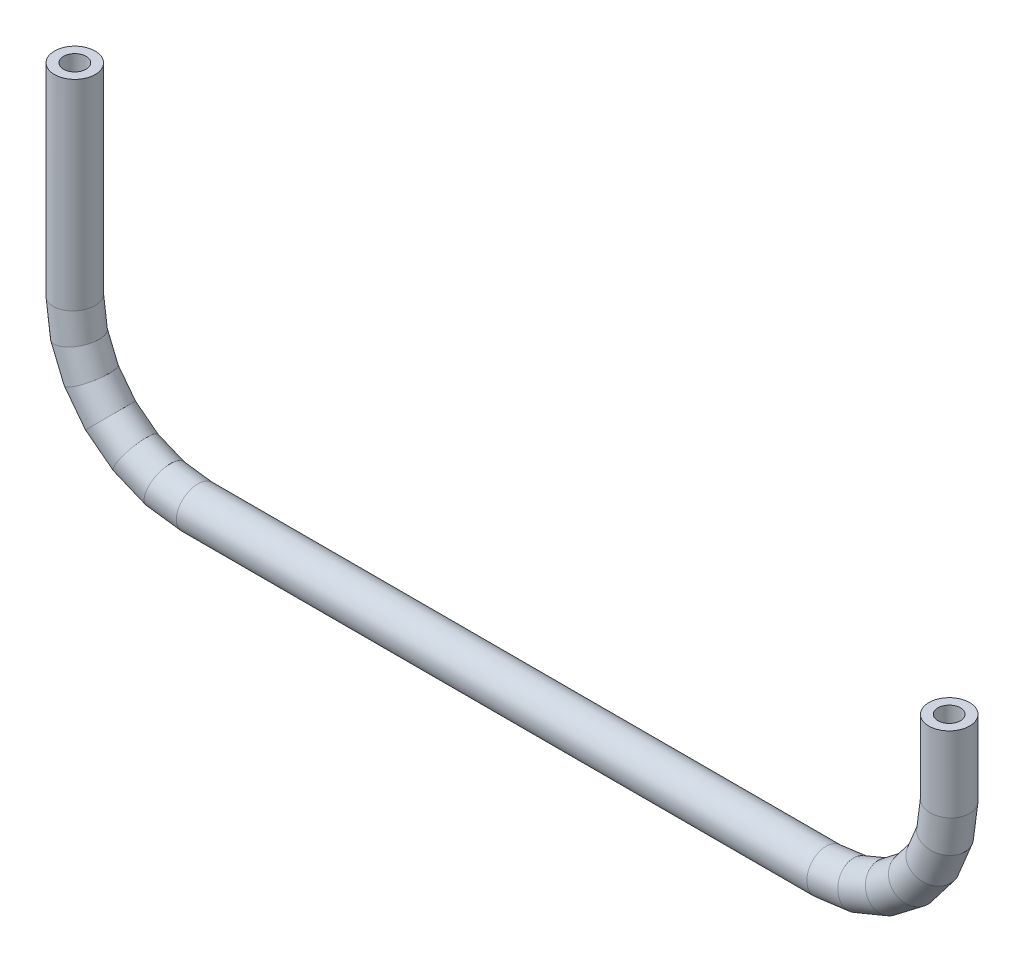
ISO-10303-21;
HEADER;
FILE_DESCRIPTION(('STEP AP214'),'2;1');
FILE_NAME('part.step','',(''),(''),'','','');
FILE_SCHEMA(('AUTOMOTIVE_DESIGN { 1 0 10303 214 1 1 1 1 }'));
ENDSEC;
DATA;
#1=APPLICATION_CONTEXT('core data for automotive mechanical design processes');
#2=APPLICATION_PROTOCOL_DEFINITION('international standard','automotive_design',2000,#1);
#3=PRODUCT_CONTEXT('',#1,'mechanical');
#4=PRODUCT('Part','Part','',(#3));
#5=PRODUCT_RELATED_PRODUCT_CATEGORY('part','',(#4));
#6=PRODUCT_DEFINITION_FORMATION('','',#4);
#7=PRODUCT_DEFINITION_CONTEXT('part definition',#1,'design');
#8=PRODUCT_DEFINITION('design','',#6,#7);
#9=PRODUCT_DEFINITION_SHAPE('','',#8);
#10=(LENGTH_UNIT() NAMED_UNIT(*) SI_UNIT(.MILLI.,.METRE.));
#11=(NAMED_UNIT(*) PLANE_ANGLE_UNIT() SI_UNIT($,.RADIAN.));
#12=(NAMED_UNIT(*) SI_UNIT($,.STERADIAN.) SOLID_ANGLE_UNIT());
#13=UNCERTAINTY_MEASURE_WITH_UNIT(LENGTH_MEASURE(1.E-05),#10,'distance_accuracy_value','');
#14=(GEOMETRIC_REPRESENTATION_CONTEXT(3) GLOBAL_UNCERTAINTY_ASSIGNED_CONTEXT((#13)) GLOBAL_UNIT_ASSIGNED_CONTEXT((#10,
#11,#12)) REPRESENTATION_CONTEXT('',''));
#15=CARTESIAN_POINT('',(0.,0.,0.));
#16=DIRECTION('',(0.,0.,1.));
#17=DIRECTION('',(1.,0.,0.));
#18=AXIS2_PLACEMENT_3D('',#15,#16,#17);
#19=CARTESIAN_POINT('',(-49.9999999999999,-35.9289105438822,0.));
#20=DIRECTION('',(0.,1.,0.));
#21=DIRECTION('',(0.,0.,1.));
#22=AXIS2_PLACEMENT_3D('',#19,#20,#21);
#23=CYLINDRICAL_SURFACE('',#22,1.58750000000001);
#24=CARTESIAN_POINT('',(-49.9999999999999,-35.6,0.));
#25=DIRECTION('',(0.0654031292301431,0.997858923238603,0.));
#26=DIRECTION('',(0.997858923238604,-0.0654031292301431,0.));
#27=AXIS2_PLACEMENT_3D('',#24,#25,#26);
#28=ELLIPSE('',#27,1.59090625240659,1.58750000000001);
#29=CARTESIAN_POINT('',(-48.4124999999999,-35.7040502472192,0.));
#30=VERTEX_POINT('',#29);
#31=EDGE_CURVE('E45',#30,#30,#28,.T.);
#32=ORIENTED_EDGE('',*,*,#31,.T.);
#33=EDGE_LOOP('',(#32));
#34=FACE_BOUND('',#33,.T.);
#35=CARTESIAN_POINT('',(-49.9999999999999,-29.8,0.));
#36=DIRECTION('',(0.,-1.,0.));
#37=DIRECTION('',(0.,0.,1.));
#38=AXIS2_PLACEMENT_3D('',#35,#36,#37);
#39=CIRCLE('',#38,1.58750000000001);
#40=CARTESIAN_POINT('',(-49.9999999999999,-29.8,1.58750000000001));
#41=VERTEX_POINT('',#40);
#42=EDGE_CURVE('E98',#41,#41,#39,.T.);
#43=ORIENTED_EDGE('',*,*,#42,.T.);
#44=EDGE_LOOP('',(#43));
#45=FACE_BOUND('',#44,.T.);
#46=ADVANCED_FACE('F39',(#34,#45),#23,.T.);
#47=CARTESIAN_POINT('',(-50.3967727359539,-38.6137881409399,0.));
#48=DIRECTION('',(0.130526192220052,0.99144486137381,0.));
#49=DIRECTION('',(-0.99144486137381,0.130526192220052,0.));
#50=AXIS2_PLACEMENT_3D('',#47,#48,#49);
#51=CYLINDRICAL_SURFACE('',#50,1.58750000000001);
#52=CARTESIAN_POINT('',(-50.3237046502538,-38.058780928474,0.));
#53=DIRECTION('',(0.25881904510252,0.965925826289069,0.));
#54=DIRECTION('',(0.965925826289069,-0.25881904510252,0.));
#55=AXIS2_PLACEMENT_3D('',#52,#53,#54);
#56=ELLIPSE('',#55,1.601198474921,1.58750000000001);
#57=CARTESIAN_POINT('',(-48.7770656903129,-38.4732015887726,0.));
#58=VERTEX_POINT('',#57);
#59=EDGE_CURVE('E137',#58,#58,#56,.T.);
#60=ORIENTED_EDGE('',*,*,#59,.T.);
#61=EDGE_LOOP('',(#60));
#62=FACE_BOUND('',#61,.T.);
#63=ORIENTED_EDGE('',*,*,#31,.F.);
#64=EDGE_LOOP('',(#63));
#65=FACE_BOUND('',#64,.T.);
#66=ADVANCED_FACE('F144',(#62,#65),#51,.T.);
#67=CARTESIAN_POINT('',(-51.4869834518585,-40.8671843881292,0.));
#68=DIRECTION('',(0.382683432365088,0.923879532511287,0.));
#69=DIRECTION('',(-0.923879532511287,0.382683432365088,0.));
#70=AXIS2_PLACEMENT_3D('',#67,#68,#69);
#71=CYLINDRICAL_SURFACE('',#70,1.58750000000001);
#72=CARTESIAN_POINT('',(-51.2727586640478,-40.35,0.));
#73=DIRECTION('',(0.5,0.866025403784439,0.));
#74=DIRECTION('',(0.866025403784439,-0.5,0.));
#75=AXIS2_PLACEMENT_3D('',#72,#73,#74);
#76=ELLIPSE('',#75,1.601198474921,1.58750000000001);
#77=CARTESIAN_POINT('',(-49.8860801082653,-41.1505992374605,0.));
#78=VERTEX_POINT('',#77);
#79=EDGE_CURVE('E131',#78,#78,#76,.T.);
#80=ORIENTED_EDGE('',*,*,#79,.T.);
#81=EDGE_LOOP('',(#80));
#82=FACE_BOUND('',#81,.T.);
#83=ORIENTED_EDGE('',*,*,#59,.F.);
#84=EDGE_LOOP('',(#83));
#85=FACE_BOUND('',#84,.T.);
#86=ADVANCED_FACE('F150',(#82,#85),#71,.T.);
#87=CARTESIAN_POINT('',(-53.123268003383,-42.7616307237012,0.));
#88=DIRECTION('',(0.608761429008722,0.793353340291234,0.));
#89=DIRECTION('',(-0.793353340291234,0.608761429008722,0.));
#90=AXIS2_PLACEMENT_3D('',#87,#88,#89);
#91=CYLINDRICAL_SURFACE('',#90,1.58750000000001);
#92=CARTESIAN_POINT('',(-52.7824855787278,-42.3175144212722,0.));
#93=DIRECTION('',(0.707106781186547,0.707106781186548,0.));
#94=DIRECTION('',(0.707106781186548,-0.707106781186547,0.));
#95=AXIS2_PLACEMENT_3D('',#92,#93,#94);
#96=ELLIPSE('',#95,1.601198474921,1.58750000000001);
#97=CARTESIAN_POINT('',(-51.6502672790856,-43.4497327209144,0.));
#98=VERTEX_POINT('',#97);
#99=EDGE_CURVE('E132',#98,#98,#96,.T.);
#100=ORIENTED_EDGE('',*,*,#99,.T.);
#101=EDGE_LOOP('',(#100));
#102=FACE_BOUND('',#101,.T.);
#103=ORIENTED_EDGE('',*,*,#79,.F.);
#104=EDGE_LOOP('',(#103));
#105=FACE_BOUND('',#104,.T.);
#106=ADVANCED_FACE('F155',(#102,#105),#91,.T.);
#107=CARTESIAN_POINT('',(-55.194116302429,-44.1680237606074,0.));
#108=DIRECTION('',(0.793353340291234,0.608761429008723,0.));
#109=DIRECTION('',(-0.608761429008723,0.793353340291234,0.));
#110=AXIS2_PLACEMENT_3D('',#107,#108,#109);
#111=CYLINDRICAL_SURFACE('',#110,1.58750000000001);
#112=CARTESIAN_POINT('',(-54.75,-43.8272413359522,0.));
#113=DIRECTION('',(0.866025403784438,0.5,0.));
#114=DIRECTION('',(0.500000000000001,-0.866025403784438,0.));
#115=AXIS2_PLACEMENT_3D('',#112,#113,#114);
#116=ELLIPSE('',#115,1.601198474921,1.58750000000001);
#117=CARTESIAN_POINT('',(-53.9494007625395,-45.2139198917347,0.));
#118=VERTEX_POINT('',#117);
#119=EDGE_CURVE('E126',#118,#118,#116,.T.);
#120=ORIENTED_EDGE('',*,*,#119,.T.);
#121=EDGE_LOOP('',(#120));
#122=FACE_BOUND('',#121,.T.);
#123=ORIENTED_EDGE('',*,*,#99,.F.);
#124=EDGE_LOOP('',(#123));
#125=FACE_BOUND('',#124,.T.);
#126=ADVANCED_FACE('F266',(#122,#125),#111,.T.);
#127=CARTESIAN_POINT('',(-57.5584034596552,-44.9905201375569,0.));
#128=DIRECTION('',(0.923879532511287,0.382683432365088,0.));
#129=DIRECTION('',(-0.382683432365088,0.923879532511287,0.));
#130=AXIS2_PLACEMENT_3D('',#127,#128,#129);
#131=CYLINDRICAL_SURFACE('',#130,1.58750000000001);
#132=CARTESIAN_POINT('',(-57.041219071526,-44.7762953497462,0.));
#133=DIRECTION('',(0.965925826289068,0.25881904510252,0.));
#134=DIRECTION('',(0.25881904510252,-0.965925826289068,0.));
#135=AXIS2_PLACEMENT_3D('',#132,#133,#134);
#136=ELLIPSE('',#135,1.601198474921,1.58750000000001);
#137=CARTESIAN_POINT('',(-56.6267984112274,-46.322934309687,0.));
#138=VERTEX_POINT('',#137);
#139=EDGE_CURVE('E123',#138,#138,#136,.T.);
#140=ORIENTED_EDGE('',*,*,#139,.T.);
#141=EDGE_LOOP('',(#140));
#142=FACE_BOUND('',#141,.T.);
#143=ORIENTED_EDGE('',*,*,#119,.F.);
#144=EDGE_LOOP('',(#143));
#145=FACE_BOUND('',#144,.T.);
#146=ADVANCED_FACE('F265',(#142,#145),#131,.T.);
#147=CARTESIAN_POINT('',(-59.8260966685837,-45.142931440874,0.));
#148=DIRECTION('',(0.99144486137381,0.130526192220052,0.));
#149=DIRECTION('',(-0.130526192220052,0.99144486137381,0.));
#150=AXIS2_PLACEMENT_3D('',#147,#148,#149);
#151=CYLINDRICAL_SURFACE('',#150,1.58750000000001);
#152=CARTESIAN_POINT('',(-59.5,-45.1,0.));
#153=DIRECTION('',(0.997858923238604,0.0654031292301433,0.));
#154=DIRECTION('',(0.0654031292301433,-0.997858923238604,0.));
#155=AXIS2_PLACEMENT_3D('',#152,#153,#154);
#156=ELLIPSE('',#155,1.59090625240659,1.58750000000001);
#157=CARTESIAN_POINT('',(-59.3959497527808,-46.6875,0.));
#158=VERTEX_POINT('',#157);
#159=EDGE_CURVE('E125',#158,#158,#156,.T.);
#160=ORIENTED_EDGE('',*,*,#159,.T.);
#161=EDGE_LOOP('',(#160));
#162=FACE_BOUND('',#161,.T.);
#163=ORIENTED_EDGE('',*,*,#139,.F.);
#164=EDGE_LOOP('',(#163));
#165=FACE_BOUND('',#164,.T.);
#166=ADVANCED_FACE('F256',(#162,#165),#151,.T.);
#167=CARTESIAN_POINT('',(-108.978910543882,-45.1,0.));
#168=DIRECTION('',(1.,0.,0.));
#169=DIRECTION('',(0.,0.,-1.));
#170=AXIS2_PLACEMENT_3D('',#167,#168,#169);
#171=CYLINDRICAL_SURFACE('',#170,1.58750000000001);
#172=CARTESIAN_POINT('',(-108.65,-45.1,0.));
#173=DIRECTION('',(0.997858923238603,-0.0654031292301436,0.));
#174=DIRECTION('',(-0.0654031292301436,-0.997858923238604,0.));
#175=AXIS2_PLACEMENT_3D('',#172,#173,#174);
#176=ELLIPSE('',#175,1.59090625240659,1.58750000000001);
#177=CARTESIAN_POINT('',(-108.754050247219,-46.6875,0.));
#178=VERTEX_POINT('',#177);
#179=EDGE_CURVE('E116',#178,#178,#176,.T.);
#180=ORIENTED_EDGE('',*,*,#179,.T.);
#181=EDGE_LOOP('',(#180));
#182=FACE_BOUND('',#181,.T.);
#183=ORIENTED_EDGE('',*,*,#159,.F.);
#184=EDGE_LOOP('',(#183));
#185=FACE_BOUND('',#184,.T.);
#186=ADVANCED_FACE('F255',(#182,#185),#171,.T.);
#187=CARTESIAN_POINT('',(-111.66378814094,-44.703227264046,0.));
#188=DIRECTION('',(0.99144486137381,-0.130526192220053,0.));
#189=DIRECTION('',(0.130526192220053,0.99144486137381,0.));
#190=AXIS2_PLACEMENT_3D('',#187,#188,#189);
#191=CYLINDRICAL_SURFACE('',#190,1.58750000000001);
#192=CARTESIAN_POINT('',(-111.108780928474,-44.7762953497462,0.));
#193=DIRECTION('',(0.965925826289068,-0.258819045102521,0.));
#194=DIRECTION('',(-0.258819045102521,-0.965925826289068,0.));
#195=AXIS2_PLACEMENT_3D('',#192,#193,#194);
#196=ELLIPSE('',#195,1.601198474921,1.58750000000001);
#197=CARTESIAN_POINT('',(-111.523201588773,-46.322934309687,0.));
#198=VERTEX_POINT('',#197);
#199=EDGE_CURVE('E117',#198,#198,#196,.T.);
#200=ORIENTED_EDGE('',*,*,#199,.T.);
#201=EDGE_LOOP('',(#200));
#202=FACE_BOUND('',#201,.T.);
#203=ORIENTED_EDGE('',*,*,#179,.F.);
#204=EDGE_LOOP('',(#203));
#205=FACE_BOUND('',#204,.T.);
#206=ADVANCED_FACE('F248',(#202,#205),#191,.T.);
#207=CARTESIAN_POINT('',(-113.917184388129,-43.6130165481415,0.));
#208=DIRECTION('',(0.923879532511287,-0.38268343236509,0.));
#209=DIRECTION('',(0.38268343236509,0.923879532511287,0.));
#210=AXIS2_PLACEMENT_3D('',#207,#208,#209);
#211=CYLINDRICAL_SURFACE('',#210,1.58750000000001);
#212=CARTESIAN_POINT('',(-113.4,-43.8272413359522,0.));
#213=DIRECTION('',(0.866025403784439,-0.5,0.));
#214=DIRECTION('',(-0.5,-0.866025403784439,0.));
#215=AXIS2_PLACEMENT_3D('',#212,#213,#214);
#216=ELLIPSE('',#215,1.601198474921,1.58750000000001);
#217=CARTESIAN_POINT('',(-114.200599237461,-45.2139198917347,0.));
#218=VERTEX_POINT('',#217);
#219=EDGE_CURVE('E114',#218,#218,#216,.T.);
#220=ORIENTED_EDGE('',*,*,#219,.T.);
#221=EDGE_LOOP('',(#220));
#222=FACE_BOUND('',#221,.T.);
#223=ORIENTED_EDGE('',*,*,#199,.F.);
#224=EDGE_LOOP('',(#223));
#225=FACE_BOUND('',#224,.T.);
#226=ADVANCED_FACE('F247',(#222,#225),#211,.T.);
#227=CARTESIAN_POINT('',(-115.811630723701,-41.9767319966171,0.));
#228=DIRECTION('',(0.793353340291235,-0.608761429008721,0.));
#229=DIRECTION('',(0.608761429008721,0.793353340291235,0.));
#230=AXIS2_PLACEMENT_3D('',#227,#228,#229);
#231=CYLINDRICAL_SURFACE('',#230,1.58750000000001);
#232=CARTESIAN_POINT('',(-115.367514421272,-42.3175144212722,0.));
#233=DIRECTION('',(0.707106781186549,-0.707106781186546,0.));
#234=DIRECTION('',(-0.707106781186546,-0.707106781186549,0.));
#235=AXIS2_PLACEMENT_3D('',#232,#233,#234);
#236=ELLIPSE('',#235,1.601198474921,1.58750000000001);
#237=CARTESIAN_POINT('',(-116.499732720914,-43.4497327209144,0.));
#238=VERTEX_POINT('',#237);
#239=EDGE_CURVE('E109',#238,#238,#236,.T.);
#240=ORIENTED_EDGE('',*,*,#239,.T.);
#241=EDGE_LOOP('',(#240));
#242=FACE_BOUND('',#241,.T.);
#243=ORIENTED_EDGE('',*,*,#219,.F.);
#244=EDGE_LOOP('',(#243));
#245=FACE_BOUND('',#244,.T.);
#246=ADVANCED_FACE('F245',(#242,#245),#231,.T.);
#247=CARTESIAN_POINT('',(-117.218023760607,-39.905883697571,0.));
#248=DIRECTION('',(0.608761429008724,-0.793353340291233,0.));
#249=DIRECTION('',(0.793353340291233,0.608761429008724,0.));
#250=AXIS2_PLACEMENT_3D('',#247,#248,#249);
#251=CYLINDRICAL_SURFACE('',#250,1.58750000000001);
#252=CARTESIAN_POINT('',(-116.877241335952,-40.35,0.));
#253=DIRECTION('',(0.500000000000002,-0.866025403784437,0.));
#254=DIRECTION('',(-0.866025403784437,-0.500000000000002,0.));
#255=AXIS2_PLACEMENT_3D('',#252,#253,#254);
#256=ELLIPSE('',#255,1.601198474921,1.58750000000001);
#257=CARTESIAN_POINT('',(-118.263919891735,-41.1505992374605,0.));
#258=VERTEX_POINT('',#257);
#259=EDGE_CURVE('E110',#258,#258,#256,.T.);
#260=ORIENTED_EDGE('',*,*,#259,.T.);
#261=EDGE_LOOP('',(#260));
#262=FACE_BOUND('',#261,.T.);
#263=ORIENTED_EDGE('',*,*,#239,.F.);
#264=EDGE_LOOP('',(#263));
#265=FACE_BOUND('',#264,.T.);
#266=ADVANCED_FACE('F236',(#262,#265),#251,.T.);
#267=CARTESIAN_POINT('',(-118.040520137557,-37.5415965403448,0.));
#268=DIRECTION('',(0.382683432365091,-0.923879532511286,0.));
#269=DIRECTION('',(0.923879532511287,0.382683432365091,0.));
#270=AXIS2_PLACEMENT_3D('',#267,#268,#269);
#271=CYLINDRICAL_SURFACE('',#270,1.58750000000001);
#272=CARTESIAN_POINT('',(-117.826295349746,-38.058780928474,0.));
#273=DIRECTION('',(0.25881904510252,-0.965925826289069,0.));
#274=DIRECTION('',(-0.965925826289069,-0.25881904510252,0.));
#275=AXIS2_PLACEMENT_3D('',#272,#273,#274);
#276=ELLIPSE('',#275,1.601198474921,1.58750000000001);
#277=CARTESIAN_POINT('',(-119.372934309687,-38.4732015887726,0.));
#278=VERTEX_POINT('',#277);
#279=EDGE_CURVE('E102',#278,#278,#276,.T.);
#280=ORIENTED_EDGE('',*,*,#279,.T.);
#281=EDGE_LOOP('',(#280));
#282=FACE_BOUND('',#281,.T.);
#283=ORIENTED_EDGE('',*,*,#259,.F.);
#284=EDGE_LOOP('',(#283));
#285=FACE_BOUND('',#284,.T.);
#286=ADVANCED_FACE('F231',(#282,#285),#271,.T.);
#287=CARTESIAN_POINT('',(-118.192931440874,-35.2739033314163,0.));
#288=DIRECTION('',(0.130526192220049,-0.991444861373811,0.));
#289=DIRECTION('',(0.991444861373811,0.130526192220049,0.));
#290=AXIS2_PLACEMENT_3D('',#287,#288,#289);
#291=CYLINDRICAL_SURFACE('',#290,1.58750000000001);
#292=CARTESIAN_POINT('',(-118.15,-35.6,0.));
#293=DIRECTION('',(0.0654031292301417,-0.997858923238604,0.));
#294=DIRECTION('',(-0.997858923238604,-0.0654031292301417,0.));
#295=AXIS2_PLACEMENT_3D('',#292,#293,#294);
#296=ELLIPSE('',#295,1.59090625240659,1.58750000000001);
#297=CARTESIAN_POINT('',(-119.7375,-35.7040502472192,0.));
#298=VERTEX_POINT('',#297);
#299=EDGE_CURVE('E101',#298,#298,#296,.T.);
#300=ORIENTED_EDGE('',*,*,#299,.T.);
#301=EDGE_LOOP('',(#300));
#302=FACE_BOUND('',#301,.T.);
#303=ORIENTED_EDGE('',*,*,#279,.F.);
#304=EDGE_LOOP('',(#303));
#305=FACE_BOUND('',#304,.T.);
#306=ADVANCED_FACE('F228',(#302,#305),#291,.T.);
#307=CARTESIAN_POINT('',(-118.15,-19.9,0.));
#308=DIRECTION('',(0.,-1.,0.));
#309=DIRECTION('',(0.,0.,-1.));
#310=AXIS2_PLACEMENT_3D('',#307,#308,#309);
#311=CYLINDRICAL_SURFACE('',#310,1.58750000000001);
#312=CARTESIAN_POINT('',(-118.15,-19.9,0.));
#313=DIRECTION('',(0.,1.,0.));
#314=DIRECTION('',(0.,0.,1.));
#315=AXIS2_PLACEMENT_3D('',#312,#313,#314);
#316=CIRCLE('',#315,1.58750000000001);
#317=CARTESIAN_POINT('',(-118.15,-19.9,1.58750000000001));
#318=VERTEX_POINT('',#317);
#319=EDGE_CURVE('E92',#318,#318,#316,.T.);
#320=ORIENTED_EDGE('',*,*,#319,.F.);
#321=EDGE_LOOP('',(#320));
#322=FACE_BOUND('',#321,.T.);
#323=ORIENTED_EDGE('',*,*,#299,.F.);
#324=EDGE_LOOP('',(#323));
#325=FACE_BOUND('',#324,.T.);
#326=ADVANCED_FACE('F227',(#322,#325),#311,.T.);
#327=CARTESIAN_POINT('',(-49.9999999999999,-29.8,0.));
#328=DIRECTION('',(0.,-1.,0.));
#329=DIRECTION('',(0.,0.,1.));
#330=AXIS2_PLACEMENT_3D('',#327,#328,#329);
#331=PLANE('',#330);
#332=CARTESIAN_POINT('',(-49.9999999999999,-29.8,0.));
#333=DIRECTION('',(0.,-1.,0.));
#334=DIRECTION('',(0.,0.,1.));
#335=AXIS2_PLACEMENT_3D('',#332,#333,#334);
#336=CIRCLE('',#335,0.877500000000003);
#337=CARTESIAN_POINT('',(-49.9999999999999,-29.8,0.877500000000003));
#338=VERTEX_POINT('',#337);
#339=EDGE_CURVE('E95',#338,#338,#336,.F.);
#340=ORIENTED_EDGE('',*,*,#339,.F.);
#341=EDGE_LOOP('',(#340));
#342=FACE_BOUND('',#341,.T.);
#343=ORIENTED_EDGE('',*,*,#42,.F.);
#344=EDGE_LOOP('',(#343));
#345=FACE_BOUND('',#344,.T.);
#346=ADVANCED_FACE('F225',(#342,#345),#331,.F.);
#347=CARTESIAN_POINT('',(-118.15,-19.9,0.));
#348=DIRECTION('',(0.,1.,0.));
#349=DIRECTION('',(0.,0.,1.));
#350=AXIS2_PLACEMENT_3D('',#347,#348,#349);
#351=PLANE('',#350);
#352=CARTESIAN_POINT('',(-118.15,-19.9,0.));
#353=DIRECTION('',(0.,1.,0.));
#354=DIRECTION('',(0.,0.,1.));
#355=AXIS2_PLACEMENT_3D('',#352,#353,#354);
#356=CIRCLE('',#355,0.877500000000003);
#357=CARTESIAN_POINT('',(-118.15,-19.9,0.877500000000003));
#358=VERTEX_POINT('',#357);
#359=EDGE_CURVE('E46',#358,#358,#356,.F.);
#360=ORIENTED_EDGE('',*,*,#359,.T.);
#361=EDGE_LOOP('',(#360));
#362=FACE_BOUND('',#361,.T.);
#363=ORIENTED_EDGE('',*,*,#319,.T.);
#364=EDGE_LOOP('',(#363));
#365=FACE_BOUND('',#364,.T.);
#366=ADVANCED_FACE('F217',(#362,#365),#351,.T.);
#367=CARTESIAN_POINT('',(-49.9999999999999,-35.8265316549648,0.));
#368=DIRECTION('',(0.,1.,0.));
#369=DIRECTION('',(0.,0.,1.));
#370=AXIS2_PLACEMENT_3D('',#367,#368,#369);
#371=CYLINDRICAL_SURFACE('',#370,0.877500000000003);
#372=CARTESIAN_POINT('',(-49.9999999999999,-35.6,0.));
#373=DIRECTION('',(0.0654031292301431,0.997858923238603,0.));
#374=DIRECTION('',(0.997858923238604,-0.0654031292301431,0.));
#375=AXIS2_PLACEMENT_3D('',#372,#373,#374);
#376=ELLIPSE('',#375,0.879382826133409,0.877500000000003);
#377=CARTESIAN_POINT('',(-49.1224999999999,-35.6575143886204,0.));
#378=VERTEX_POINT('',#377);
#379=EDGE_CURVE('E90',#378,#378,#376,.F.);
#380=ORIENTED_EDGE('',*,*,#379,.T.);
#381=EDGE_LOOP('',(#380));
#382=FACE_BOUND('',#381,.T.);
#383=ORIENTED_EDGE('',*,*,#339,.T.);
#384=EDGE_LOOP('',(#383));
#385=FACE_BOUND('',#384,.T.);
#386=ADVANCED_FACE('F212',(#382,#385),#371,.F.);
#387=CARTESIAN_POINT('',(-50.3699311729936,-38.4099062286922,0.));
#388=DIRECTION('',(0.130526192220052,0.99144486137381,0.));
#389=DIRECTION('',(-0.99144486137381,0.130526192220052,0.));
#390=AXIS2_PLACEMENT_3D('',#387,#388,#389);
#391=CYLINDRICAL_SURFACE('',#390,0.877500000000003);
#392=CARTESIAN_POINT('',(-50.3237046502538,-38.058780928474,0.));
#393=DIRECTION('',(0.25881904510252,0.965925826289068,0.));
#394=DIRECTION('',(0.965925826289068,-0.25881904510252,0.));
#395=AXIS2_PLACEMENT_3D('',#392,#393,#394);
#396=ELLIPSE('',#395,0.885071912909087,0.877500000000003);
#397=CARTESIAN_POINT('',(-49.4687908314518,-38.2878543958202,0.));
#398=VERTEX_POINT('',#397);
#399=EDGE_CURVE('E88',#398,#398,#396,.F.);
#400=ORIENTED_EDGE('',*,*,#399,.T.);
#401=EDGE_LOOP('',(#400));
#402=FACE_BOUND('',#401,.T.);
#403=ORIENTED_EDGE('',*,*,#379,.F.);
#404=EDGE_LOOP('',(#403));
#405=FACE_BOUND('',#404,.T.);
#406=ADVANCED_FACE('F209',(#402,#405),#391,.F.);
#407=CARTESIAN_POINT('',(-51.4082879711355,-40.6771966912704,0.));
#408=DIRECTION('',(0.382683432365088,0.923879532511287,0.));
#409=DIRECTION('',(-0.923879532511288,0.382683432365088,0.));
#410=AXIS2_PLACEMENT_3D('',#407,#408,#409);
#411=CYLINDRICAL_SURFACE('',#410,0.877500000000003);
#412=CARTESIAN_POINT('',(-51.2727586640478,-40.35,0.));
#413=DIRECTION('',(0.5,0.866025403784439,0.));
#414=DIRECTION('',(0.866025403784439,-0.5,0.));
#415=AXIS2_PLACEMENT_3D('',#412,#413,#414);
#416=ELLIPSE('',#415,0.885071912909087,0.877500000000003);
#417=CARTESIAN_POINT('',(-50.5062639032925,-40.7925359564545,0.));
#418=VERTEX_POINT('',#417);
#419=EDGE_CURVE('E84',#418,#418,#416,.F.);
#420=ORIENTED_EDGE('',*,*,#419,.T.);
#421=EDGE_LOOP('',(#420));
#422=FACE_BOUND('',#421,.T.);
#423=ORIENTED_EDGE('',*,*,#399,.F.);
#424=EDGE_LOOP('',(#423));
#425=FACE_BOUND('',#424,.T.);
#426=ADVANCED_FACE('F206',(#422,#425),#411,.F.);
#427=CARTESIAN_POINT('',(-52.9980815718582,-42.5984845898027,0.));
#428=DIRECTION('',(0.608761429008722,0.793353340291234,0.));
#429=DIRECTION('',(-0.793353340291234,0.608761429008722,0.));
#430=AXIS2_PLACEMENT_3D('',#427,#428,#429);
#431=CYLINDRICAL_SURFACE('',#430,0.877500000000003);
#432=CARTESIAN_POINT('',(-52.7824855787278,-42.3175144212722,0.));
#433=DIRECTION('',(0.707106781186547,0.707106781186548,0.));
#434=DIRECTION('',(0.707106781186548,-0.707106781186547,0.));
#435=AXIS2_PLACEMENT_3D('',#432,#433,#434);
#436=ELLIPSE('',#435,0.885071912909087,0.877500000000003);
#437=CARTESIAN_POINT('',(-52.156645227272,-42.943354772728,0.));
#438=VERTEX_POINT('',#437);
#439=EDGE_CURVE('E78',#438,#438,#436,.F.);
#440=ORIENTED_EDGE('',*,*,#439,.T.);
#441=EDGE_LOOP('',(#440));
#442=FACE_BOUND('',#441,.T.);
#443=ORIENTED_EDGE('',*,*,#419,.F.);
#444=EDGE_LOOP('',(#443));
#445=FACE_BOUND('',#444,.T.);
#446=ADVANCED_FACE('F205',(#442,#445),#431,.F.);
#447=CARTESIAN_POINT('',(-55.0309701685305,-44.0428373290826,0.));
#448=DIRECTION('',(0.793353340291234,0.608761429008723,0.));
#449=DIRECTION('',(-0.608761429008723,0.793353340291234,0.));
#450=AXIS2_PLACEMENT_3D('',#447,#448,#449);
#451=CYLINDRICAL_SURFACE('',#450,0.877500000000003);
#452=CARTESIAN_POINT('',(-54.75,-43.8272413359522,0.));
#453=DIRECTION('',(0.866025403784438,0.5,0.));
#454=DIRECTION('',(0.5,-0.866025403784438,0.));
#455=AXIS2_PLACEMENT_3D('',#452,#453,#454);
#456=ELLIPSE('',#455,0.885071912909088,0.877500000000003);
#457=CARTESIAN_POINT('',(-54.3074640435454,-44.5937360967076,0.));
#458=VERTEX_POINT('',#457);
#459=EDGE_CURVE('E80',#458,#458,#456,.F.);
#460=ORIENTED_EDGE('',*,*,#459,.T.);
#461=EDGE_LOOP('',(#460));
#462=FACE_BOUND('',#461,.T.);
#463=ORIENTED_EDGE('',*,*,#439,.F.);
#464=EDGE_LOOP('',(#463));
#465=FACE_BOUND('',#464,.T.);
#466=ADVANCED_FACE('F196',(#462,#465),#451,.F.);
#467=CARTESIAN_POINT('',(-57.3684157627963,-44.911824656834,0.));
#468=DIRECTION('',(0.923879532511287,0.382683432365088,0.));
#469=DIRECTION('',(-0.382683432365088,0.923879532511288,0.));
#470=AXIS2_PLACEMENT_3D('',#467,#468,#469);
#471=CYLINDRICAL_SURFACE('',#470,0.877500000000003);
#472=CARTESIAN_POINT('',(-57.041219071526,-44.7762953497462,0.));
#473=DIRECTION('',(0.965925826289068,0.25881904510252,0.));
#474=DIRECTION('',(0.25881904510252,-0.965925826289068,0.));
#475=AXIS2_PLACEMENT_3D('',#472,#473,#474);
#476=ELLIPSE('',#475,0.885071912909087,0.877500000000003);
#477=CARTESIAN_POINT('',(-56.8121456041799,-45.6312091685481,0.));
#478=VERTEX_POINT('',#477);
#479=EDGE_CURVE('E74',#478,#478,#476,.F.);
#480=ORIENTED_EDGE('',*,*,#479,.T.);
#481=EDGE_LOOP('',(#480));
#482=FACE_BOUND('',#481,.T.);
#483=ORIENTED_EDGE('',*,*,#459,.F.);
#484=EDGE_LOOP('',(#483));
#485=FACE_BOUND('',#484,.T.);
#486=ADVANCED_FACE('F191',(#482,#485),#471,.F.);
#487=CARTESIAN_POINT('',(-59.7245936452534,-45.1295683143399,0.));
#488=DIRECTION('',(0.99144486137381,0.130526192220052,0.));
#489=DIRECTION('',(-0.130526192220052,0.99144486137381,0.));
#490=AXIS2_PLACEMENT_3D('',#487,#488,#489);
#491=CYLINDRICAL_SURFACE('',#490,0.877500000000003);
#492=CARTESIAN_POINT('',(-59.5,-45.1,0.));
#493=DIRECTION('',(0.997858923238603,0.0654031292301433,0.));
#494=DIRECTION('',(0.0654031292301433,-0.997858923238603,0.));
#495=AXIS2_PLACEMENT_3D('',#492,#493,#494);
#496=ELLIPSE('',#495,0.879382826133409,0.877500000000003);
#497=CARTESIAN_POINT('',(-59.4424856113796,-45.9775,0.));
#498=VERTEX_POINT('',#497);
#499=EDGE_CURVE('E72',#498,#498,#496,.F.);
#500=ORIENTED_EDGE('',*,*,#499,.T.);
#501=EDGE_LOOP('',(#500));
#502=FACE_BOUND('',#501,.T.);
#503=ORIENTED_EDGE('',*,*,#479,.F.);
#504=EDGE_LOOP('',(#503));
#505=FACE_BOUND('',#504,.T.);
#506=ADVANCED_FACE('F188',(#502,#505),#491,.F.);
#507=CARTESIAN_POINT('',(-108.876531654965,-45.1,0.));
#508=DIRECTION('',(1.,0.,0.));
#509=DIRECTION('',(0.,0.,-1.));
#510=AXIS2_PLACEMENT_3D('',#507,#508,#509);
#511=CYLINDRICAL_SURFACE('',#510,0.877500000000003);
#512=CARTESIAN_POINT('',(-108.65,-45.1,0.));
#513=DIRECTION('',(0.997858923238603,-0.0654031292301436,0.));
#514=DIRECTION('',(-0.0654031292301436,-0.997858923238603,0.));
#515=AXIS2_PLACEMENT_3D('',#512,#513,#514);
#516=ELLIPSE('',#515,0.879382826133409,0.877500000000003);
#517=CARTESIAN_POINT('',(-108.70751438862,-45.9775,0.));
#518=VERTEX_POINT('',#517);
#519=EDGE_CURVE('E69',#518,#518,#516,.F.);
#520=ORIENTED_EDGE('',*,*,#519,.T.);
#521=EDGE_LOOP('',(#520));
#522=FACE_BOUND('',#521,.T.);
#523=ORIENTED_EDGE('',*,*,#499,.F.);
#524=EDGE_LOOP('',(#523));
#525=FACE_BOUND('',#524,.T.);
#526=ADVANCED_FACE('F187',(#522,#525),#511,.F.);
#527=CARTESIAN_POINT('',(-111.459906228692,-44.7300688270063,0.));
#528=DIRECTION('',(0.99144486137381,-0.130526192220053,0.));
#529=DIRECTION('',(0.130526192220053,0.99144486137381,0.));
#530=AXIS2_PLACEMENT_3D('',#527,#528,#529);
#531=CYLINDRICAL_SURFACE('',#530,0.877500000000003);
#532=CARTESIAN_POINT('',(-111.108780928474,-44.7762953497462,0.));
#533=DIRECTION('',(0.965925826289068,-0.258819045102521,0.));
#534=DIRECTION('',(-0.258819045102521,-0.965925826289068,0.));
#535=AXIS2_PLACEMENT_3D('',#532,#533,#534);
#536=ELLIPSE('',#535,0.885071912909087,0.877500000000003);
#537=CARTESIAN_POINT('',(-111.33785439582,-45.6312091685482,0.));
#538=VERTEX_POINT('',#537);
#539=EDGE_CURVE('E63',#538,#538,#536,.F.);
#540=ORIENTED_EDGE('',*,*,#539,.T.);
#541=EDGE_LOOP('',(#540));
#542=FACE_BOUND('',#541,.T.);
#543=ORIENTED_EDGE('',*,*,#519,.F.);
#544=EDGE_LOOP('',(#543));
#545=FACE_BOUND('',#544,.T.);
#546=ADVANCED_FACE('F185',(#542,#545),#531,.F.);
#547=CARTESIAN_POINT('',(-113.72719669127,-43.6917120288644,0.));
#548=DIRECTION('',(0.923879532511287,-0.38268343236509,0.));
#549=DIRECTION('',(0.38268343236509,0.923879532511287,0.));
#550=AXIS2_PLACEMENT_3D('',#547,#548,#549);
#551=CYLINDRICAL_SURFACE('',#550,0.877500000000003);
#552=CARTESIAN_POINT('',(-113.4,-43.8272413359522,0.));
#553=DIRECTION('',(0.866025403784439,-0.5,0.));
#554=DIRECTION('',(-0.5,-0.866025403784439,0.));
#555=AXIS2_PLACEMENT_3D('',#552,#553,#554);
#556=ELLIPSE('',#555,0.885071912909087,0.877500000000003);
#557=CARTESIAN_POINT('',(-113.842535956455,-44.5937360967076,0.));
#558=VERTEX_POINT('',#557);
#559=EDGE_CURVE('E65',#558,#558,#556,.F.);
#560=ORIENTED_EDGE('',*,*,#559,.T.);
#561=EDGE_LOOP('',(#560));
#562=FACE_BOUND('',#561,.T.);
#563=ORIENTED_EDGE('',*,*,#539,.F.);
#564=EDGE_LOOP('',(#563));
#565=FACE_BOUND('',#564,.T.);
#566=ADVANCED_FACE('F179',(#562,#565),#551,.F.);
#567=CARTESIAN_POINT('',(-115.648484589803,-42.1019184281418,0.));
#568=DIRECTION('',(0.793353340291235,-0.608761429008721,0.));
#569=DIRECTION('',(0.608761429008721,0.793353340291235,0.));
#570=AXIS2_PLACEMENT_3D('',#567,#568,#569);
#571=CYLINDRICAL_SURFACE('',#570,0.877500000000003);
#572=CARTESIAN_POINT('',(-115.367514421272,-42.3175144212722,0.));
#573=DIRECTION('',(0.707106781186549,-0.707106781186546,0.));
#574=DIRECTION('',(-0.707106781186546,-0.707106781186549,0.));
#575=AXIS2_PLACEMENT_3D('',#572,#573,#574);
#576=ELLIPSE('',#575,0.885071912909087,0.877500000000003);
#577=CARTESIAN_POINT('',(-115.993354772728,-42.943354772728,0.));
#578=VERTEX_POINT('',#577);
#579=EDGE_CURVE('E56',#578,#578,#576,.F.);
#580=ORIENTED_EDGE('',*,*,#579,.T.);
#581=EDGE_LOOP('',(#580));
#582=FACE_BOUND('',#581,.T.);
#583=ORIENTED_EDGE('',*,*,#559,.F.);
#584=EDGE_LOOP('',(#583));
#585=FACE_BOUND('',#584,.T.);
#586=ADVANCED_FACE('F171',(#582,#585),#571,.F.);
#587=CARTESIAN_POINT('',(-117.092837329083,-40.0690298314695,0.));
#588=DIRECTION('',(0.608761429008724,-0.793353340291233,0.));
#589=DIRECTION('',(0.793353340291233,0.608761429008724,0.));
#590=AXIS2_PLACEMENT_3D('',#587,#588,#589);
#591=CYLINDRICAL_SURFACE('',#590,0.877500000000003);
#592=CARTESIAN_POINT('',(-116.877241335952,-40.35,0.));
#593=DIRECTION('',(0.500000000000002,-0.866025403784437,0.));
#594=DIRECTION('',(-0.866025403784437,-0.500000000000002,0.));
#595=AXIS2_PLACEMENT_3D('',#592,#593,#594);
#596=ELLIPSE('',#595,0.885071912909088,0.877500000000003);
#597=CARTESIAN_POINT('',(-117.643736096708,-40.7925359564546,0.));
#598=VERTEX_POINT('',#597);
#599=EDGE_CURVE('E57',#598,#598,#596,.F.);
#600=ORIENTED_EDGE('',*,*,#599,.T.);
#601=EDGE_LOOP('',(#600));
#602=FACE_BOUND('',#601,.T.);
#603=ORIENTED_EDGE('',*,*,#579,.F.);
#604=EDGE_LOOP('',(#603));
#605=FACE_BOUND('',#604,.T.);
#606=ADVANCED_FACE('F168',(#602,#605),#591,.F.);
#607=CARTESIAN_POINT('',(-117.961824656834,-37.7315842372036,0.));
#608=DIRECTION('',(0.382683432365091,-0.923879532511286,0.));
#609=DIRECTION('',(0.923879532511286,0.382683432365091,0.));
#610=AXIS2_PLACEMENT_3D('',#607,#608,#609);
#611=CYLINDRICAL_SURFACE('',#610,0.877500000000003);
#612=CARTESIAN_POINT('',(-117.826295349746,-38.058780928474,0.));
#613=DIRECTION('',(0.25881904510252,-0.965925826289068,0.));
#614=DIRECTION('',(-0.965925826289069,-0.25881904510252,0.));
#615=AXIS2_PLACEMENT_3D('',#612,#613,#614);
#616=ELLIPSE('',#615,0.885071912909088,0.877500000000003);
#617=CARTESIAN_POINT('',(-118.681209168548,-38.2878543958201,0.));
#618=VERTEX_POINT('',#617);
#619=EDGE_CURVE('E51',#618,#618,#616,.F.);
#620=ORIENTED_EDGE('',*,*,#619,.T.);
#621=EDGE_LOOP('',(#620));
#622=FACE_BOUND('',#621,.T.);
#623=ORIENTED_EDGE('',*,*,#599,.F.);
#624=EDGE_LOOP('',(#623));
#625=FACE_BOUND('',#624,.T.);
#626=ADVANCED_FACE('F162',(#622,#625),#611,.F.);
#627=CARTESIAN_POINT('',(-118.17956831434,-35.3754063547466,0.));
#628=DIRECTION('',(0.130526192220049,-0.991444861373811,0.));
#629=DIRECTION('',(0.991444861373811,0.130526192220049,0.));
#630=AXIS2_PLACEMENT_3D('',#627,#628,#629);
#631=CYLINDRICAL_SURFACE('',#630,0.877500000000003);
#632=CARTESIAN_POINT('',(-118.15,-35.6,0.));
#633=DIRECTION('',(0.0654031292301417,-0.997858923238604,0.));
#634=DIRECTION('',(-0.997858923238604,-0.0654031292301417,0.));
#635=AXIS2_PLACEMENT_3D('',#632,#633,#634);
#636=ELLIPSE('',#635,0.879382826133409,0.877500000000003);
#637=CARTESIAN_POINT('',(-119.0275,-35.6575143886204,0.));
#638=VERTEX_POINT('',#637);
#639=EDGE_CURVE('E10',#638,#638,#636,.F.);
#640=ORIENTED_EDGE('',*,*,#639,.T.);
#641=EDGE_LOOP('',(#640));
#642=FACE_BOUND('',#641,.T.);
#643=ORIENTED_EDGE('',*,*,#619,.F.);
#644=EDGE_LOOP('',(#643));
#645=FACE_BOUND('',#644,.T.);
#646=ADVANCED_FACE('F160',(#642,#645),#631,.F.);
#647=CARTESIAN_POINT('',(-118.15,-19.9,0.));
#648=DIRECTION('',(0.,-1.,0.));
#649=DIRECTION('',(0.,0.,-1.));
#650=AXIS2_PLACEMENT_3D('',#647,#648,#649);
#651=CYLINDRICAL_SURFACE('',#650,0.877500000000003);
#652=ORIENTED_EDGE('',*,*,#359,.F.);
#653=EDGE_LOOP('',(#652));
#654=FACE_BOUND('',#653,.T.);
#655=ORIENTED_EDGE('',*,*,#639,.F.);
#656=EDGE_LOOP('',(#655));
#657=FACE_BOUND('',#656,.T.);
#658=ADVANCED_FACE('F154',(#654,#657),#651,.F.);
#659=CLOSED_SHELL('',(#46,#66,#86,#106,#126,#146,#166,#186,#206,#226,#246,#266,#286,#306,#326,
#346,#366,#386,#406,#426,#446,#466,#486,#506,#526,#546,#566,#586,#606,#626,#646,#658));
#660=MANIFOLD_SOLID_BREP('B2',#659);
#661=ADVANCED_BREP_SHAPE_REPRESENTATION('',(#18,#660),#14);
#662=SHAPE_DEFINITION_REPRESENTATION(#9,#661);
ENDSEC;
END-ISO-10303-21;
